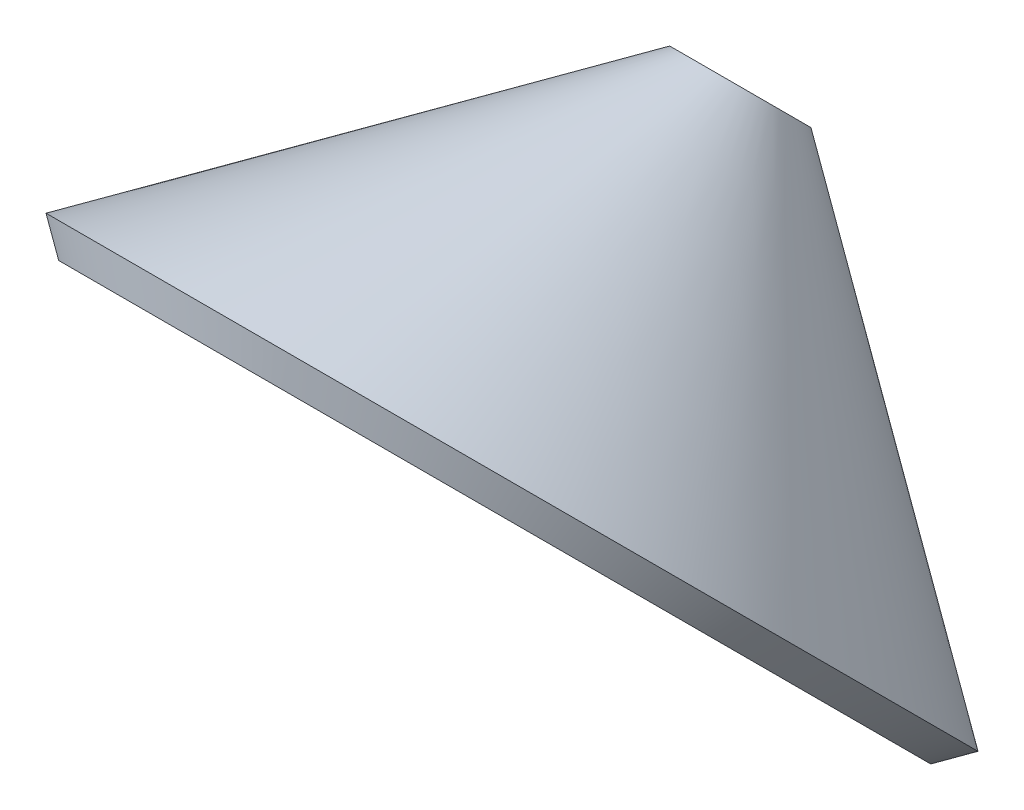
ISO-10303-21;
HEADER;
FILE_DESCRIPTION(('STEP AP214'),'2;1');
FILE_NAME('part.step','',(''),(''),'','','');
FILE_SCHEMA(('AUTOMOTIVE_DESIGN { 1 0 10303 214 1 1 1 1 }'));
ENDSEC;
DATA;
#1=APPLICATION_CONTEXT('core data for automotive mechanical design processes');
#2=APPLICATION_PROTOCOL_DEFINITION('international standard','automotive_design',2000,#1);
#3=PRODUCT_CONTEXT('',#1,'mechanical');
#4=PRODUCT('Part','Part','',(#3));
#5=PRODUCT_RELATED_PRODUCT_CATEGORY('part','',(#4));
#6=PRODUCT_DEFINITION_FORMATION('','',#4);
#7=PRODUCT_DEFINITION_CONTEXT('part definition',#1,'design');
#8=PRODUCT_DEFINITION('design','',#6,#7);
#9=PRODUCT_DEFINITION_SHAPE('','',#8);
#10=(LENGTH_UNIT() NAMED_UNIT(*) SI_UNIT(.MILLI.,.METRE.));
#11=(NAMED_UNIT(*) PLANE_ANGLE_UNIT() SI_UNIT($,.RADIAN.));
#12=(NAMED_UNIT(*) SI_UNIT($,.STERADIAN.) SOLID_ANGLE_UNIT());
#13=UNCERTAINTY_MEASURE_WITH_UNIT(LENGTH_MEASURE(1.E-05),#10,'distance_accuracy_value','');
#14=(GEOMETRIC_REPRESENTATION_CONTEXT(3) GLOBAL_UNCERTAINTY_ASSIGNED_CONTEXT((#13)) GLOBAL_UNIT_ASSIGNED_CONTEXT((#10,
#11,#12)) REPRESENTATION_CONTEXT('',''));
#15=CARTESIAN_POINT('',(0.,0.,0.));
#16=DIRECTION('',(0.,0.,1.));
#17=DIRECTION('',(1.,0.,0.));
#18=AXIS2_PLACEMENT_3D('',#15,#16,#17);
#19=CARTESIAN_POINT('',(0.,28.,4.));
#20=DIRECTION('',(0.,0.707106781186544,-0.707106781186552));
#21=DIRECTION('',(0.,0.707106781186552,0.707106781186544));
#22=AXIS2_PLACEMENT_3D('',#19,#20,#21);
#23=CONICAL_SURFACE('',#22,0.,0.785398163397442);
#24=CARTESIAN_POINT('',(0.,33.,-1.00000000000006));
#25=DIRECTION('',(0.,-0.707106781186544,0.707106781186552));
#26=DIRECTION('',(0.,-0.707106781186552,-0.707106781186544));
#27=AXIS2_PLACEMENT_3D('',#24,#25,#26);
#28=CIRCLE('',#27,7.07106781186544);
#29=CARTESIAN_POINT('',(0.,28.,-6.00000000000001));
#30=VERTEX_POINT('',#29);
#31=EDGE_CURVE('E11',#30,#30,#28,.T.);
#32=ORIENTED_EDGE('',*,*,#31,.F.);
#33=EDGE_LOOP('',(#32));
#34=FACE_BOUND('',#33,.T.);
#35=CARTESIAN_POINT('',(0.,28.,4.));
#36=VERTEX_POINT('',#35);
#37=VERTEX_LOOP('',#36);
#38=FACE_BOUND('',#37,.T.);
#39=ADVANCED_FACE('F43',(#34,#38),#23,.F.);
#40=CARTESIAN_POINT('',(0.,5.00000000000031,26.9999999999999));
#41=DIRECTION('',(0.,-0.707106781186544,0.707106781186552));
#42=DIRECTION('',(0.,-0.707106781186552,-0.707106781186544));
#43=AXIS2_PLACEMENT_3D('',#40,#41,#42);
#44=CONICAL_SURFACE('',#43,46.6690475583123,0.785398163397454);
#45=CARTESIAN_POINT('',(0.,5.00000000000031,26.9999999999999));
#46=DIRECTION('',(0.,-0.707106781186544,0.707106781186552));
#47=DIRECTION('',(0.,-0.707106781186552,-0.707106781186544));
#48=AXIS2_PLACEMENT_3D('',#45,#46,#47);
#49=CIRCLE('',#48,46.6690475583123);
#50=CARTESIAN_POINT('',(0.,-28.,-6.));
#51=VERTEX_POINT('',#50);
#52=EDGE_CURVE('E51',#51,#51,#49,.T.);
#53=CARTESIAN_POINT('',(0.,28.,-6.00000000000001));
#54=CARTESIAN_POINT('',(0.,27.4166666666667,-6.00000000000001));
#55=CARTESIAN_POINT('',(0.,26.8333333333333,-6.00000000000001));
#56=CARTESIAN_POINT('',(0.,25.6666666666667,-6.00000000000001));
#57=CARTESIAN_POINT('',(0.,25.0833333333333,-6.00000000000001));
#58=CARTESIAN_POINT('',(0.,23.9166666666667,-6.00000000000001));
#59=CARTESIAN_POINT('',(0.,23.3333333333333,-6.00000000000001));
#60=CARTESIAN_POINT('',(0.,22.1666666666667,-6.00000000000001));
#61=CARTESIAN_POINT('',(0.,21.5833333333333,-6.00000000000001));
#62=CARTESIAN_POINT('',(0.,20.4166666666667,-6.00000000000001));
#63=CARTESIAN_POINT('',(0.,19.8333333333333,-6.00000000000001));
#64=CARTESIAN_POINT('',(0.,18.6666666666667,-6.00000000000001));
#65=CARTESIAN_POINT('',(0.,18.0833333333333,-6.00000000000001));
#66=CARTESIAN_POINT('',(0.,16.9166666666667,-6.));
#67=CARTESIAN_POINT('',(0.,16.3333333333333,-6.00000000000001));
#68=CARTESIAN_POINT('',(0.,15.1666666666667,-6.00000000000001));
#69=CARTESIAN_POINT('',(0.,14.5833333333333,-6.));
#70=CARTESIAN_POINT('',(0.,13.4166666666667,-6.));
#71=CARTESIAN_POINT('',(0.,12.8333333333333,-6.));
#72=CARTESIAN_POINT('',(0.,11.6666666666667,-6.));
#73=CARTESIAN_POINT('',(0.,11.0833333333333,-6.));
#74=CARTESIAN_POINT('',(0.,9.91666666666666,-6.00000000000001));
#75=CARTESIAN_POINT('',(0.,9.33333333333333,-6.00000000000001));
#76=CARTESIAN_POINT('',(0.,8.16666666666666,-6.00000000000001));
#77=CARTESIAN_POINT('',(0.,7.58333333333333,-6.));
#78=CARTESIAN_POINT('',(0.,6.41666666666666,-6.));
#79=CARTESIAN_POINT('',(0.,5.83333333333333,-6.));
#80=CARTESIAN_POINT('',(0.,4.66666666666666,-6.));
#81=CARTESIAN_POINT('',(0.,4.08333333333333,-6.00000000000001));
#82=CARTESIAN_POINT('',(0.,2.91666666666666,-6.00000000000001));
#83=CARTESIAN_POINT('',(0.,2.33333333333333,-6.));
#84=CARTESIAN_POINT('',(0.,1.16666666666666,-6.));
#85=CARTESIAN_POINT('',(0.,0.583333333333327,-6.));
#86=CARTESIAN_POINT('',(0.,-0.583333333333339,-6.));
#87=CARTESIAN_POINT('',(0.,-1.16666666666667,-6.));
#88=CARTESIAN_POINT('',(0.,-2.33333333333334,-6.));
#89=CARTESIAN_POINT('',(0.,-2.91666666666667,-6.));
#90=CARTESIAN_POINT('',(0.,-4.08333333333334,-6.));
#91=CARTESIAN_POINT('',(0.,-4.66666666666667,-6.));
#92=CARTESIAN_POINT('',(0.,-5.83333333333334,-6.));
#93=CARTESIAN_POINT('',(0.,-6.41666666666667,-6.));
#94=CARTESIAN_POINT('',(0.,-7.58333333333334,-6.));
#95=CARTESIAN_POINT('',(0.,-8.16666666666667,-6.));
#96=CARTESIAN_POINT('',(0.,-9.33333333333334,-6.));
#97=CARTESIAN_POINT('',(0.,-9.91666666666667,-6.));
#98=CARTESIAN_POINT('',(0.,-11.0833333333333,-6.));
#99=CARTESIAN_POINT('',(0.,-11.6666666666667,-6.));
#100=CARTESIAN_POINT('',(0.,-12.8333333333333,-6.));
#101=CARTESIAN_POINT('',(0.,-13.4166666666667,-6.));
#102=CARTESIAN_POINT('',(0.,-14.5833333333333,-6.));
#103=CARTESIAN_POINT('',(0.,-15.1666666666667,-6.));
#104=CARTESIAN_POINT('',(0.,-16.3333333333333,-6.));
#105=CARTESIAN_POINT('',(0.,-16.9166666666667,-6.));
#106=CARTESIAN_POINT('',(0.,-18.0833333333333,-6.));
#107=CARTESIAN_POINT('',(0.,-18.6666666666667,-6.));
#108=CARTESIAN_POINT('',(0.,-19.8333333333333,-6.));
#109=CARTESIAN_POINT('',(0.,-20.4166666666667,-6.));
#110=CARTESIAN_POINT('',(0.,-21.5833333333333,-6.));
#111=CARTESIAN_POINT('',(0.,-22.1666666666667,-6.));
#112=CARTESIAN_POINT('',(0.,-23.3333333333333,-6.));
#113=CARTESIAN_POINT('',(0.,-23.9166666666667,-6.));
#114=CARTESIAN_POINT('',(0.,-25.0833333333333,-6.));
#115=CARTESIAN_POINT('',(0.,-25.6666666666667,-6.));
#116=CARTESIAN_POINT('',(0.,-26.8333333333333,-6.));
#117=CARTESIAN_POINT('',(0.,-27.4166666666667,-6.));
#118=CARTESIAN_POINT('',(0.,-28.,-6.));
#119=B_SPLINE_CURVE_WITH_KNOTS('',3,(#53,#54,#55,#56,#57,#58,#59,#60,#61,#62,#63,#64,#65,#66,
#67,#68,#69,#70,#71,#72,#73,#74,#75,#76,#77,#78,#79,#80,#81,#82,#83,#84,#85,#86,#87,#88,#89,#90,
#91,#92,#93,#94,#95,#96,#97,#98,#99,#100,#101,#102,#103,#104,#105,#106,#107,#108,#109,#110,#111,
#112,#113,#114,#115,#116,#117,#118),.UNSPECIFIED.,.F.,.F.,(4,2,2,2,2,2,2,2,2,2,2,2,2,2,2,2,2,2,
2,2,2,2,2,2,2,2,2,2,2,2,2,2,4),(0.,1.75,3.49999999999999,5.25,6.99999999999999,8.74999999999999,
10.5,12.25,14.,15.75,17.5,19.25,21.,22.75,24.5,26.25,28.,29.75,31.5,33.25,35.,36.75,38.5,40.25,
42.,43.75,45.5,47.25,49.,50.75,52.5,54.25,56.),.UNSPECIFIED.);
#120=EDGE_CURVE('BSEAM70',#30,#51,#119,.T.);
#121=ORIENTED_EDGE('',*,*,#31,.T.);
#122=ORIENTED_EDGE('',*,*,#52,.F.);
#123=ORIENTED_EDGE('',*,*,#120,.T.);
#124=ORIENTED_EDGE('',*,*,#120,.F.);
#125=EDGE_LOOP('',(#121,#123,#122,#124));
#126=FACE_BOUND('',#125,.T.);
#127=ADVANCED_FACE('F70',(#126),#44,.T.);
#128=CARTESIAN_POINT('',(0.,2.87606677719273,29.1239332228076));
#129=DIRECTION('',(0.,0.707106781186544,-0.707106781186552));
#130=DIRECTION('',(0.,0.707106781186552,0.707106781186544));
#131=AXIS2_PLACEMENT_3D('',#128,#129,#130);
#132=CONICAL_SURFACE('',#131,43.6653523890431,0.785398163397442);
#133=ORIENTED_EDGE('',*,*,#52,.T.);
#134=EDGE_LOOP('',(#133));
#135=FACE_BOUND('',#134,.T.);
#136=CARTESIAN_POINT('',(0.,2.87606677719273,29.1239332228076));
#137=DIRECTION('',(0.,-0.707106781186544,0.707106781186552));
#138=DIRECTION('',(0.,-0.707106781186552,-0.707106781186544));
#139=AXIS2_PLACEMENT_3D('',#136,#137,#138);
#140=CIRCLE('',#139,43.6653523890431);
#141=CARTESIAN_POINT('',(0.,-28.,-1.75213355438484));
#142=VERTEX_POINT('',#141);
#143=EDGE_CURVE('E83',#142,#142,#140,.T.);
#144=ORIENTED_EDGE('',*,*,#143,.F.);
#145=EDGE_LOOP('',(#144));
#146=FACE_BOUND('',#145,.T.);
#147=ADVANCED_FACE('F75',(#135,#146),#132,.T.);
#148=CARTESIAN_POINT('',(0.,14.8760667771926,17.1239332228076));
#149=DIRECTION('',(0.,-0.707106781186544,0.707106781186552));
#150=DIRECTION('',(0.,-0.707106781186552,-0.707106781186544));
#151=AXIS2_PLACEMENT_3D('',#148,#149,#150);
#152=CONICAL_SURFACE('',#151,26.6947896405658,0.785398163397454);
#153=ORIENTED_EDGE('',*,*,#143,.T.);
#154=EDGE_LOOP('',(#153));
#155=FACE_BOUND('',#154,.T.);
#156=CARTESIAN_POINT('',(0.,14.8760667771926,17.1239332228076));
#157=DIRECTION('',(0.,-0.707106781186544,0.707106781186552));
#158=DIRECTION('',(0.,-0.707106781186552,-0.707106781186544));
#159=AXIS2_PLACEMENT_3D('',#156,#157,#158);
#160=CIRCLE('',#159,26.6947896405658);
#161=CARTESIAN_POINT('',(0.,-4.00000000000001,-1.75213355438484));
#162=VERTEX_POINT('',#161);
#163=EDGE_CURVE('E86',#162,#162,#160,.T.);
#164=ORIENTED_EDGE('',*,*,#163,.F.);
#165=EDGE_LOOP('',(#164));
#166=FACE_BOUND('',#165,.T.);
#167=ADVANCED_FACE('F123',(#155,#166),#152,.F.);
#168=CARTESIAN_POINT('',(0.,12.8145627874367,19.1854372125635));
#169=DIRECTION('',(0.,0.707106781186544,-0.707106781186552));
#170=DIRECTION('',(0.,0.707106781186552,0.707106781186544));
#171=AXIS2_PLACEMENT_3D('',#168,#169,#170);
#172=CONICAL_SURFACE('',#171,23.7793827393668,0.785398163397443);
#173=ORIENTED_EDGE('',*,*,#163,.T.);
#174=EDGE_LOOP('',(#173));
#175=FACE_BOUND('',#174,.T.);
#176=CARTESIAN_POINT('',(0.,12.8145627874367,19.1854372125635));
#177=DIRECTION('',(0.,-0.707106781186544,0.707106781186552));
#178=DIRECTION('',(0.,-0.707106781186552,-0.707106781186544));
#179=AXIS2_PLACEMENT_3D('',#176,#177,#178);
#180=CIRCLE('',#179,23.7793827393668);
#181=CARTESIAN_POINT('',(0.,-4.,2.37087442512699));
#182=VERTEX_POINT('',#181);
#183=EDGE_CURVE('E92',#182,#182,#180,.T.);
#184=ORIENTED_EDGE('',*,*,#183,.F.);
#185=EDGE_LOOP('',(#184));
#186=FACE_BOUND('',#185,.T.);
#187=ADVANCED_FACE('F117',(#175,#186),#172,.T.);
#188=CARTESIAN_POINT('',(0.,14.8145627874367,17.1854372125635));
#189=DIRECTION('',(0.,-0.707106781186544,0.707106781186552));
#190=DIRECTION('',(0.,-0.707106781186552,-0.707106781186544));
#191=AXIS2_PLACEMENT_3D('',#188,#189,#190);
#192=CONICAL_SURFACE('',#191,20.9509556146206,0.785398163397454);
#193=ORIENTED_EDGE('',*,*,#183,.T.);
#194=EDGE_LOOP('',(#193));
#195=FACE_BOUND('',#194,.T.);
#196=CARTESIAN_POINT('',(0.,14.8145627874367,17.1854372125635));
#197=DIRECTION('',(0.,-0.707106781186544,0.707106781186552));
#198=DIRECTION('',(0.,-0.707106781186552,-0.707106781186544));
#199=AXIS2_PLACEMENT_3D('',#196,#197,#198);
#200=CIRCLE('',#199,20.9509556146206);
#201=CARTESIAN_POINT('',(0.,0.,2.370874425127));
#202=VERTEX_POINT('',#201);
#203=EDGE_CURVE('E96',#202,#202,#200,.T.);
#204=ORIENTED_EDGE('',*,*,#203,.F.);
#205=EDGE_LOOP('',(#204));
#206=FACE_BOUND('',#205,.T.);
#207=ADVANCED_FACE('F111',(#195,#206),#192,.F.);
#208=CARTESIAN_POINT('',(0.,16.3145627874366,15.6854372125635));
#209=DIRECTION('',(0.,-0.707106781186544,0.707106781186552));
#210=DIRECTION('',(0.,-0.707106781186552,-0.707106781186544));
#211=AXIS2_PLACEMENT_3D('',#208,#209,#210);
#212=TOROIDAL_SURFACE('',#211,18.8296352710609,3.);
#213=ORIENTED_EDGE('',*,*,#203,.T.);
#214=EDGE_LOOP('',(#213));
#215=FACE_BOUND('',#214,.T.);
#216=CARTESIAN_POINT('',(0.,18.3263114636967,13.6736885363034));
#217=DIRECTION('',(0.,-0.707106781186544,0.707106781186552));
#218=DIRECTION('',(0.,-0.707106781186552,-0.707106781186544));
#219=AXIS2_PLACEMENT_3D('',#216,#217,#218);
#220=CIRCLE('',#219,19.7813361311698);
#221=CARTESIAN_POINT('',(0.,4.338794544416,-0.313828382977082));
#222=VERTEX_POINT('',#221);
#223=EDGE_CURVE('E100',#222,#222,#220,.T.);
#224=ORIENTED_EDGE('',*,*,#223,.F.);
#225=EDGE_LOOP('',(#224));
#226=FACE_BOUND('',#225,.T.);
#227=ADVANCED_FACE('F65',(#215,#226),#212,.F.);
#228=CARTESIAN_POINT('',(0.,21.5000000000001,10.5));
#229=DIRECTION('',(0.,-0.707106781186544,0.707106781186552));
#230=DIRECTION('',(0.,-0.707106781186552,-0.707106781186544));
#231=AXIS2_PLACEMENT_3D('',#228,#229,#230);
#232=CONICAL_SURFACE('',#231,6.36396103067898,1.24798532154182);
#233=CARTESIAN_POINT('',(0.,21.5000000000001,10.5));
#234=DIRECTION('',(0.,-0.707106781186544,0.707106781186552));
#235=DIRECTION('',(0.,-0.707106781186552,-0.707106781186544));
#236=AXIS2_PLACEMENT_3D('',#233,#234,#235);
#237=CIRCLE('',#236,6.36396103067898);
#238=CARTESIAN_POINT('',(0.,17.,6.00000000000001));
#239=VERTEX_POINT('',#238);
#240=EDGE_CURVE('E104',#239,#239,#237,.T.);
#241=CARTESIAN_POINT('',(0.,4.338794544416,-0.313828382977082));
#242=CARTESIAN_POINT('',(0.,4.470682101245,-0.24805933732107));
#243=CARTESIAN_POINT('',(0.,4.602569658074,-0.182290291665059));
#244=CARTESIAN_POINT('',(0.,4.866344771732,-0.0507522003530376));
#245=CARTESIAN_POINT('',(0.,4.998232328561,0.0150168453029729));
#246=CARTESIAN_POINT('',(0.,5.262007442219,0.146554936614997));
#247=CARTESIAN_POINT('',(0.,5.393894999048,0.21232398227101));
#248=CARTESIAN_POINT('',(0.,5.657670112706,0.343862073583033));
#249=CARTESIAN_POINT('',(0.,5.789557669535,0.409631119239043));
#250=CARTESIAN_POINT('',(0.,6.053332783193,0.541169210551064));
#251=CARTESIAN_POINT('',(0.,6.185220340022,0.606938256207075));
#252=CARTESIAN_POINT('',(0.,6.44899545368,0.738476347519098));
#253=CARTESIAN_POINT('',(0.,6.580883010509,0.804245393175111));
#254=CARTESIAN_POINT('',(0.,6.844658124167,0.935783484487134));
#255=CARTESIAN_POINT('',(0.,6.976545680996,1.00155253014315));
#256=CARTESIAN_POINT('',(0.,7.240320794654,1.13309062145517));
#257=CARTESIAN_POINT('',(0.,7.372208351483,1.19885966711118));
#258=CARTESIAN_POINT('',(0.,7.635983465141,1.3303977584232));
#259=CARTESIAN_POINT('',(0.,7.76787102197,1.39616680407921));
#260=CARTESIAN_POINT('',(0.,8.031646135628,1.52770489539124));
#261=CARTESIAN_POINT('',(0.,8.163533692457,1.59347394104725));
#262=CARTESIAN_POINT('',(0.,8.427308806115,1.72501203235927));
#263=CARTESIAN_POINT('',(0.,8.559196362944,1.79078107801528));
#264=CARTESIAN_POINT('',(0.,8.822971476602,1.9223191693273));
#265=CARTESIAN_POINT('',(0.,8.954859033431,1.98808821498331));
#266=CARTESIAN_POINT('',(0.,9.218634147089,2.11962630629534));
#267=CARTESIAN_POINT('',(0.,9.350521703918,2.18539535195135));
#268=CARTESIAN_POINT('',(0.,9.614296817576,2.31693344326337));
#269=CARTESIAN_POINT('',(0.,9.746184374405,2.38270248891938));
#270=CARTESIAN_POINT('',(0.,10.009959488063,2.5142405802314));
#271=CARTESIAN_POINT('',(0.,10.141847044892,2.58000962588742));
#272=CARTESIAN_POINT('',(0.,10.40562215855,2.71154771719944));
#273=CARTESIAN_POINT('',(0.,10.537509715379,2.77731676285545));
#274=CARTESIAN_POINT('',(0.,10.801284829037,2.90885485416747));
#275=CARTESIAN_POINT('',(0.,10.933172385866,2.97462389982349));
#276=CARTESIAN_POINT('',(0.,11.196947499524,3.10616199113551));
#277=CARTESIAN_POINT('',(0.,11.328835056353,3.17193103679152));
#278=CARTESIAN_POINT('',(0.,11.592610170011,3.30346912810354));
#279=CARTESIAN_POINT('',(0.,11.72449772684,3.36923817375955));
#280=CARTESIAN_POINT('',(0.,11.988272840498,3.50077626507157));
#281=CARTESIAN_POINT('',(0.,12.120160397327,3.56654531072759));
#282=CARTESIAN_POINT('',(0.,12.383935510985,3.69808340203961));
#283=CARTESIAN_POINT('',(0.,12.515823067814,3.76385244769562));
#284=CARTESIAN_POINT('',(0.,12.779598181472,3.89539053900764));
#285=CARTESIAN_POINT('',(0.,12.911485738301,3.96115958466365));
#286=CARTESIAN_POINT('',(0.,13.175260851959,4.09269767597568));
#287=CARTESIAN_POINT('',(0.,13.307148408788,4.15846672163169));
#288=CARTESIAN_POINT('',(0.,13.570923522446,4.29000481294371));
#289=CARTESIAN_POINT('',(0.,13.702811079275,4.35577385859972));
#290=CARTESIAN_POINT('',(0.,13.966586192933,4.48731194991175));
#291=CARTESIAN_POINT('',(0.,14.098473749762,4.55308099556776));
#292=CARTESIAN_POINT('',(0.,14.36224886342,4.68461908687978));
#293=CARTESIAN_POINT('',(0.,14.494136420249,4.75038813253579));
#294=CARTESIAN_POINT('',(0.,14.757911533907,4.88192622384781));
#295=CARTESIAN_POINT('',(0.,14.889799090736,4.94769526950382));
#296=CARTESIAN_POINT('',(0.,15.153574204394,5.07923336081585));
#297=CARTESIAN_POINT('',(0.,15.285461761223,5.14500240647186));
#298=CARTESIAN_POINT('',(0.,15.549236874881,5.27654049778388));
#299=CARTESIAN_POINT('',(0.,15.68112443171,5.34230954343989));
#300=CARTESIAN_POINT('',(0.,15.944899545368,5.47384763475191));
#301=CARTESIAN_POINT('',(0.,16.076787102197,5.53961668040793));
#302=CARTESIAN_POINT('',(0.,16.340562215855,5.67115477171995));
#303=CARTESIAN_POINT('',(0.,16.472449772684,5.73692381737596));
#304=CARTESIAN_POINT('',(0.,16.736224886342,5.86846190868798));
#305=CARTESIAN_POINT('',(0.,16.868112443171,5.934230954344));
#306=CARTESIAN_POINT('',(0.,17.,6.00000000000001));
#307=B_SPLINE_CURVE_WITH_KNOTS('',3,(#241,#242,#243,#244,#245,#246,#247,#248,#249,#250,#251,
#252,#253,#254,#255,#256,#257,#258,#259,#260,#261,#262,#263,#264,#265,#266,#267,#268,#269,#270,
#271,#272,#273,#274,#275,#276,#277,#278,#279,#280,#281,#282,#283,#284,#285,#286,#287,#288,#289,
#290,#291,#292,#293,#294,#295,#296,#297,#298,#299,#300,#301,#302,#303,#304,#305,#306),
.UNSPECIFIED.,.F.,.F.,(4,2,2,2,2,2,2,2,2,2,2,2,2,2,2,2,2,2,2,2,2,2,2,2,2,2,2,2,2,2,2,2,4),(0.,
0.442130133688519,0.884260267377035,1.32639040106556,1.76852053475407,2.21065066844259,
2.65278080213111,3.09491093581963,3.53704106950815,3.97917120319666,4.42130133688518,
4.8634314705737,5.30556160426222,5.74769173795074,6.18982187163925,6.63195200532777,
7.07408213901629,7.51621227270481,7.95834240639333,8.40047254008184,8.84260267377036,
9.28473280745888,9.7268629411474,10.1689930748359,10.6111232085244,11.053253342213,
11.4953834759015,11.93751360959,12.3796437432785,12.821773876967,13.2639040106555,
13.7060341443441,14.1481642780326),.UNSPECIFIED.);
#308=EDGE_CURVE('BSEAM59',#222,#239,#307,.T.);
#309=ORIENTED_EDGE('',*,*,#223,.T.);
#310=ORIENTED_EDGE('',*,*,#240,.F.);
#311=ORIENTED_EDGE('',*,*,#308,.T.);
#312=ORIENTED_EDGE('',*,*,#308,.F.);
#313=EDGE_LOOP('',(#309,#311,#310,#312));
#314=FACE_BOUND('',#313,.T.);
#315=ADVANCED_FACE('F59',(#314),#232,.F.);
#316=CARTESIAN_POINT('',(0.,26.,6.));
#317=DIRECTION('',(0.,-0.707106781186544,0.707106781186552));
#318=DIRECTION('',(0.,-0.707106781186552,-0.707106781186544));
#319=AXIS2_PLACEMENT_3D('',#316,#317,#318);
#320=CONICAL_SURFACE('',#319,0.,0.785398163397454);
#321=ORIENTED_EDGE('',*,*,#240,.T.);
#322=EDGE_LOOP('',(#321));
#323=FACE_BOUND('',#322,.T.);
#324=CARTESIAN_POINT('',(0.,26.,6.));
#325=VERTEX_POINT('',#324);
#326=VERTEX_LOOP('',#325);
#327=FACE_BOUND('',#326,.T.);
#328=ADVANCED_FACE('F57',(#323,#327),#320,.F.);
#329=CLOSED_SHELL('',(#39,#127,#147,#167,#187,#207,#227,#315,#328));
#330=MANIFOLD_SOLID_BREP('B2',#329);
#331=ADVANCED_BREP_SHAPE_REPRESENTATION('',(#18,#330),#14);
#332=SHAPE_DEFINITION_REPRESENTATION(#9,#331);
ENDSEC;
END-ISO-10303-21;
